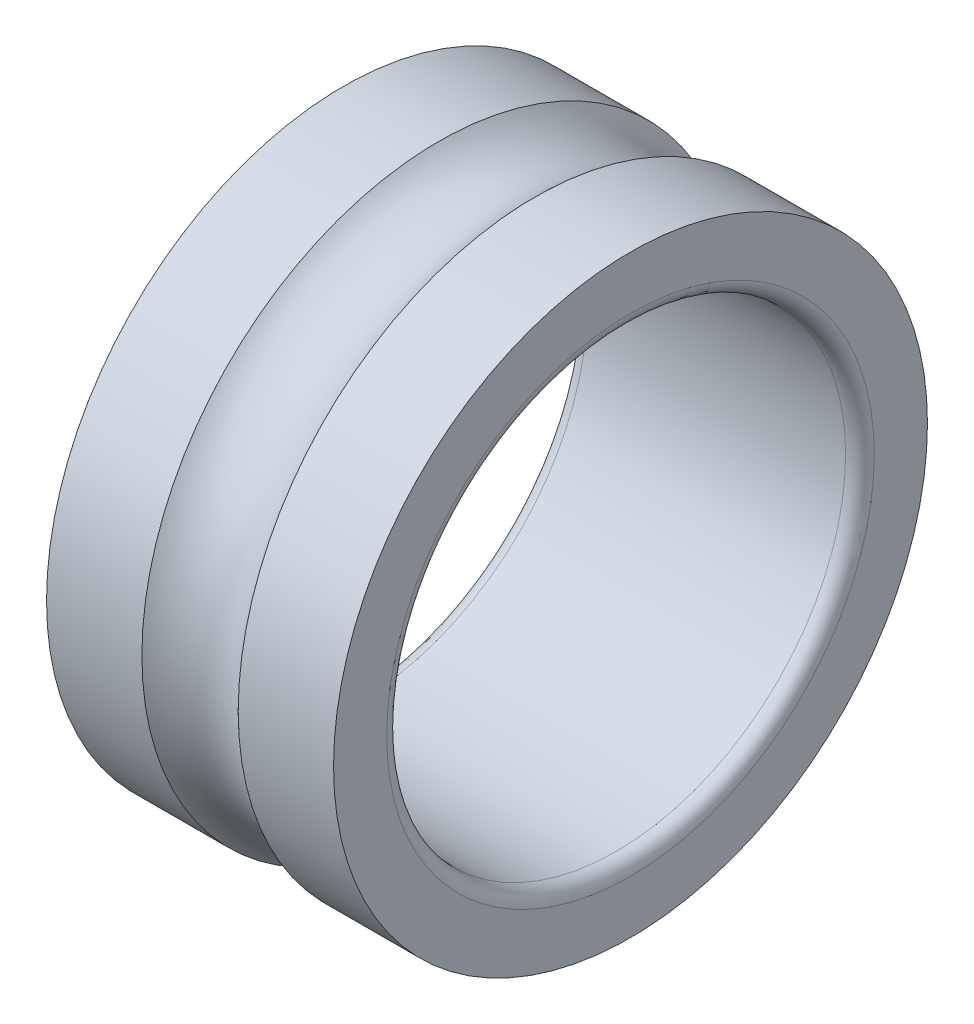
ISO-10303-21;
HEADER;
FILE_DESCRIPTION(('STEP AP214'),'2;1');
FILE_NAME('part.step','',(''),(''),'','','');
FILE_SCHEMA(('AUTOMOTIVE_DESIGN { 1 0 10303 214 1 1 1 1 }'));
ENDSEC;
DATA;
#1=APPLICATION_CONTEXT('core data for automotive mechanical design processes');
#2=APPLICATION_PROTOCOL_DEFINITION('international standard','automotive_design',2000,#1);
#3=PRODUCT_CONTEXT('',#1,'mechanical');
#4=PRODUCT('Part','Part','',(#3));
#5=PRODUCT_RELATED_PRODUCT_CATEGORY('part','',(#4));
#6=PRODUCT_DEFINITION_FORMATION('','',#4);
#7=PRODUCT_DEFINITION_CONTEXT('part definition',#1,'design');
#8=PRODUCT_DEFINITION('design','',#6,#7);
#9=PRODUCT_DEFINITION_SHAPE('','',#8);
#10=(LENGTH_UNIT() NAMED_UNIT(*) SI_UNIT(.MILLI.,.METRE.));
#11=(NAMED_UNIT(*) PLANE_ANGLE_UNIT() SI_UNIT($,.RADIAN.));
#12=(NAMED_UNIT(*) SI_UNIT($,.STERADIAN.) SOLID_ANGLE_UNIT());
#13=UNCERTAINTY_MEASURE_WITH_UNIT(LENGTH_MEASURE(1.E-05),#10,'distance_accuracy_value','');
#14=(GEOMETRIC_REPRESENTATION_CONTEXT(3) GLOBAL_UNCERTAINTY_ASSIGNED_CONTEXT((#13)) GLOBAL_UNIT_ASSIGNED_CONTEXT((#10,
#11,#12)) REPRESENTATION_CONTEXT('',''));
#15=CARTESIAN_POINT('',(0.,0.,0.));
#16=DIRECTION('',(0.,0.,1.));
#17=DIRECTION('',(1.,0.,0.));
#18=AXIS2_PLACEMENT_3D('',#15,#16,#17);
#19=CARTESIAN_POINT('',(0.,0.,0.));
#20=DIRECTION('',(1.,0.,0.));
#21=DIRECTION('',(0.,-1.,0.));
#22=AXIS2_PLACEMENT_3D('',#19,#20,#21);
#23=TOROIDAL_SURFACE('',#22,6.00075,1.175893);
#24=CARTESIAN_POINT('',(0.839755569912454,0.,0.));
#25=DIRECTION('',(1.,0.,0.));
#26=DIRECTION('',(0.,0.,-1.));
#27=AXIS2_PLACEMENT_3D('',#24,#25,#26);
#28=CIRCLE('',#27,5.1776249);
#29=CARTESIAN_POINT('',(0.839755569912454,0.,-5.1776249));
#30=VERTEX_POINT('',#29);
#31=EDGE_CURVE('E151',#30,#30,#28,.T.);
#32=ORIENTED_EDGE('',*,*,#31,.F.);
#33=EDGE_LOOP('',(#32));
#34=FACE_BOUND('',#33,.T.);
#35=CARTESIAN_POINT('',(-0.839755569912454,0.,0.));
#36=DIRECTION('',(1.,0.,0.));
#37=DIRECTION('',(0.,0.,-1.));
#38=AXIS2_PLACEMENT_3D('',#35,#36,#37);
#39=CIRCLE('',#38,5.1776249);
#40=CARTESIAN_POINT('',(-0.839755569912454,0.,-5.1776249));
#41=VERTEX_POINT('',#40);
#42=EDGE_CURVE('E149',#41,#41,#39,.F.);
#43=ORIENTED_EDGE('',*,*,#42,.F.);
#44=EDGE_LOOP('',(#43));
#45=FACE_BOUND('',#44,.T.);
#46=ADVANCED_FACE('F17',(#34,#45),#23,.F.);
#47=CARTESIAN_POINT('',(-2.75209,0.,0.));
#48=DIRECTION('',(1.,0.,0.));
#49=DIRECTION('',(0.,0.,-1.));
#50=AXIS2_PLACEMENT_3D('',#47,#48,#49);
#51=CYLINDRICAL_SURFACE('',#50,5.1776249);
#52=CARTESIAN_POINT('',(2.5019,0.,0.));
#53=DIRECTION('',(1.,0.,0.));
#54=DIRECTION('',(0.,0.,-1.));
#55=AXIS2_PLACEMENT_3D('',#52,#53,#54);
#56=CIRCLE('',#55,5.1776249);
#57=CARTESIAN_POINT('',(2.5019,0.,-5.1776249));
#58=VERTEX_POINT('',#57);
#59=EDGE_CURVE('E56',#58,#58,#56,.T.);
#60=ORIENTED_EDGE('',*,*,#59,.F.);
#61=EDGE_LOOP('',(#60));
#62=FACE_BOUND('',#61,.T.);
#63=ORIENTED_EDGE('',*,*,#31,.T.);
#64=EDGE_LOOP('',(#63));
#65=FACE_BOUND('',#64,.T.);
#66=ADVANCED_FACE('F87',(#62,#65),#51,.T.);
#67=CARTESIAN_POINT('',(-2.75209,0.,0.));
#68=DIRECTION('',(1.,0.,0.));
#69=DIRECTION('',(0.,0.,-1.));
#70=AXIS2_PLACEMENT_3D('',#67,#68,#69);
#71=CYLINDRICAL_SURFACE('',#70,5.1776249);
#72=ORIENTED_EDGE('',*,*,#42,.T.);
#73=EDGE_LOOP('',(#72));
#74=FACE_BOUND('',#73,.T.);
#75=CARTESIAN_POINT('',(-2.5019,0.,0.));
#76=DIRECTION('',(1.,0.,0.));
#77=DIRECTION('',(0.,0.,-1.));
#78=AXIS2_PLACEMENT_3D('',#75,#76,#77);
#79=CIRCLE('',#78,5.1776249);
#80=CARTESIAN_POINT('',(-2.5019,0.,-5.1776249));
#81=VERTEX_POINT('',#80);
#82=EDGE_CURVE('E62',#81,#81,#79,.T.);
#83=ORIENTED_EDGE('',*,*,#82,.T.);
#84=EDGE_LOOP('',(#83));
#85=FACE_BOUND('',#84,.T.);
#86=ADVANCED_FACE('F81',(#74,#85),#71,.T.);
#87=CARTESIAN_POINT('',(2.5019,0.,0.));
#88=DIRECTION('',(1.,0.,0.));
#89=DIRECTION('',(0.,0.,-1.));
#90=AXIS2_PLACEMENT_3D('',#87,#88,#89);
#91=PLANE('',#90);
#92=ORIENTED_EDGE('',*,*,#59,.T.);
#93=EDGE_LOOP('',(#92));
#94=FACE_BOUND('',#93,.T.);
#95=CARTESIAN_POINT('',(2.5019,0.,0.));
#96=DIRECTION('',(1.,0.,0.));
#97=DIRECTION('',(0.,1.,0.));
#98=AXIS2_PLACEMENT_3D('',#95,#96,#97);
#99=CIRCLE('',#98,4.25069);
#100=CARTESIAN_POINT('',(2.5019,4.25069,0.));
#101=VERTEX_POINT('',#100);
#102=CARTESIAN_POINT('',(2.5019,-4.25069,0.));
#103=VERTEX_POINT('',#102);
#104=EDGE_CURVE('E47',#101,#103,#99,.T.);
#105=ORIENTED_EDGE('',*,*,#104,.F.);
#106=CARTESIAN_POINT('',(2.5019,0.,0.));
#107=DIRECTION('',(1.,0.,0.));
#108=DIRECTION('',(0.,-1.,0.));
#109=AXIS2_PLACEMENT_3D('',#106,#107,#108);
#110=CIRCLE('',#109,4.25069);
#111=EDGE_CURVE('E52',#103,#101,#110,.T.);
#112=ORIENTED_EDGE('',*,*,#111,.F.);
#113=EDGE_LOOP('',(#105,#112));
#114=FACE_BOUND('',#113,.T.);
#115=ADVANCED_FACE('F60',(#94,#114),#91,.T.);
#116=CARTESIAN_POINT('',(-2.5019,0.,0.));
#117=DIRECTION('',(1.,0.,0.));
#118=DIRECTION('',(0.,0.,-1.));
#119=AXIS2_PLACEMENT_3D('',#116,#117,#118);
#120=PLANE('',#119);
#121=ORIENTED_EDGE('',*,*,#82,.F.);
#122=EDGE_LOOP('',(#121));
#123=FACE_BOUND('',#122,.T.);
#124=CARTESIAN_POINT('',(-2.5019,0.,0.));
#125=DIRECTION('',(-1.,0.,0.));
#126=DIRECTION('',(0.,-1.,0.));
#127=AXIS2_PLACEMENT_3D('',#124,#125,#126);
#128=CIRCLE('',#127,4.25069);
#129=CARTESIAN_POINT('',(-2.5019,-4.25069,0.));
#130=VERTEX_POINT('',#129);
#131=CARTESIAN_POINT('',(-2.5019,4.25069,0.));
#132=VERTEX_POINT('',#131);
#133=EDGE_CURVE('E35',#130,#132,#128,.T.);
#134=ORIENTED_EDGE('',*,*,#133,.F.);
#135=CARTESIAN_POINT('',(-2.5019,0.,0.));
#136=DIRECTION('',(-1.,0.,0.));
#137=DIRECTION('',(0.,1.,0.));
#138=AXIS2_PLACEMENT_3D('',#135,#136,#137);
#139=CIRCLE('',#138,4.25069);
#140=EDGE_CURVE('E61',#132,#130,#139,.T.);
#141=ORIENTED_EDGE('',*,*,#140,.F.);
#142=EDGE_LOOP('',(#134,#141));
#143=FACE_BOUND('',#142,.T.);
#144=ADVANCED_FACE('F80',(#123,#143),#120,.F.);
#145=CARTESIAN_POINT('',(2.25171,0.,0.));
#146=DIRECTION('',(1.,0.,0.));
#147=DIRECTION('',(0.,-1.,0.));
#148=AXIS2_PLACEMENT_3D('',#145,#146,#147);
#149=TOROIDAL_SURFACE('',#148,4.25069,0.25019);
#150=ORIENTED_EDGE('',*,*,#104,.T.);
#151=ORIENTED_EDGE('',*,*,#111,.T.);
#152=EDGE_LOOP('',(#150,#151));
#153=FACE_BOUND('',#152,.T.);
#154=CARTESIAN_POINT('',(2.25171,0.,0.));
#155=DIRECTION('',(1.,0.,0.));
#156=DIRECTION('',(0.,0.,-1.));
#157=AXIS2_PLACEMENT_3D('',#154,#155,#156);
#158=CIRCLE('',#157,4.0005);
#159=CARTESIAN_POINT('',(2.25171,0.,-4.0005));
#160=VERTEX_POINT('',#159);
#161=EDGE_CURVE('E28',#160,#160,#158,.F.);
#162=ORIENTED_EDGE('',*,*,#161,.T.);
#163=EDGE_LOOP('',(#162));
#164=FACE_BOUND('',#163,.T.);
#165=ADVANCED_FACE('F50',(#153,#164),#149,.T.);
#166=CARTESIAN_POINT('',(-2.25171,0.,0.));
#167=DIRECTION('',(1.,0.,0.));
#168=DIRECTION('',(0.,-1.,0.));
#169=AXIS2_PLACEMENT_3D('',#166,#167,#168);
#170=TOROIDAL_SURFACE('',#169,4.25069,0.25019);
#171=ORIENTED_EDGE('',*,*,#140,.T.);
#172=ORIENTED_EDGE('',*,*,#133,.T.);
#173=EDGE_LOOP('',(#171,#172));
#174=FACE_BOUND('',#173,.T.);
#175=CARTESIAN_POINT('',(-2.25171,0.,0.));
#176=DIRECTION('',(1.,0.,0.));
#177=DIRECTION('',(0.,0.,-1.));
#178=AXIS2_PLACEMENT_3D('',#175,#176,#177);
#179=CIRCLE('',#178,4.0005);
#180=CARTESIAN_POINT('',(-2.25171,0.,-4.0005));
#181=VERTEX_POINT('',#180);
#182=EDGE_CURVE('E11',#181,#181,#179,.T.);
#183=ORIENTED_EDGE('',*,*,#182,.T.);
#184=EDGE_LOOP('',(#183));
#185=FACE_BOUND('',#184,.T.);
#186=ADVANCED_FACE('F100',(#174,#185),#170,.T.);
#187=CARTESIAN_POINT('',(-2.75209,0.,0.));
#188=DIRECTION('',(1.,0.,0.));
#189=DIRECTION('',(0.,0.,-1.));
#190=AXIS2_PLACEMENT_3D('',#187,#188,#189);
#191=CYLINDRICAL_SURFACE('',#190,4.0005);
#192=ORIENTED_EDGE('',*,*,#161,.F.);
#193=EDGE_LOOP('',(#192));
#194=FACE_BOUND('',#193,.T.);
#195=ORIENTED_EDGE('',*,*,#182,.F.);
#196=EDGE_LOOP('',(#195));
#197=FACE_BOUND('',#196,.T.);
#198=ADVANCED_FACE('F98',(#194,#197),#191,.F.);
#199=CLOSED_SHELL('',(#46,#66,#86,#115,#144,#165,#186,#198));
#200=MANIFOLD_SOLID_BREP('B1',#199);
#201=ADVANCED_BREP_SHAPE_REPRESENTATION('',(#18,#200),#14);
#202=SHAPE_DEFINITION_REPRESENTATION(#9,#201);
ENDSEC;
END-ISO-10303-21;
